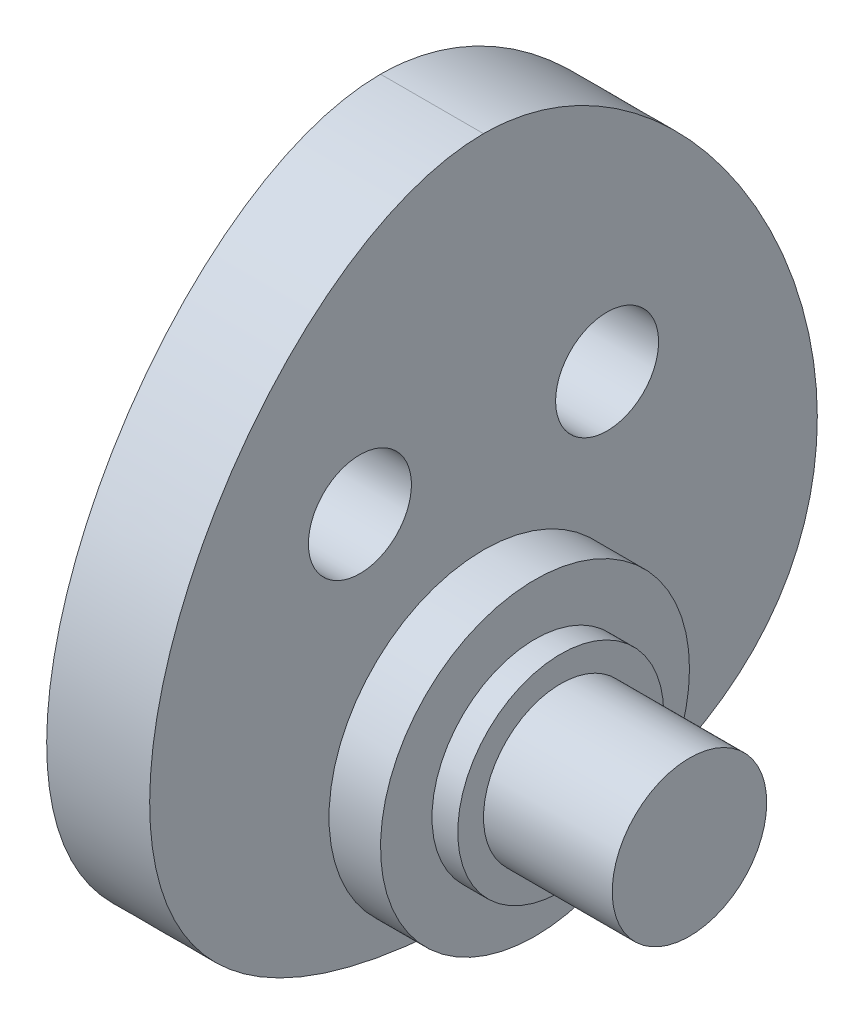
ISO-10303-21;
HEADER;
FILE_DESCRIPTION(('STEP AP214'),'2;1');
FILE_NAME('part.step','',(''),(''),'','','');
FILE_SCHEMA(('AUTOMOTIVE_DESIGN { 1 0 10303 214 1 1 1 1 }'));
ENDSEC;
DATA;
#1=APPLICATION_CONTEXT('core data for automotive mechanical design processes');
#2=APPLICATION_PROTOCOL_DEFINITION('international standard','automotive_design',2000,#1);
#3=PRODUCT_CONTEXT('',#1,'mechanical');
#4=PRODUCT('Part','Part','',(#3));
#5=PRODUCT_RELATED_PRODUCT_CATEGORY('part','',(#4));
#6=PRODUCT_DEFINITION_FORMATION('','',#4);
#7=PRODUCT_DEFINITION_CONTEXT('part definition',#1,'design');
#8=PRODUCT_DEFINITION('design','',#6,#7);
#9=PRODUCT_DEFINITION_SHAPE('','',#8);
#10=(LENGTH_UNIT() NAMED_UNIT(*) SI_UNIT(.MILLI.,.METRE.));
#11=(NAMED_UNIT(*) PLANE_ANGLE_UNIT() SI_UNIT($,.RADIAN.));
#12=(NAMED_UNIT(*) SI_UNIT($,.STERADIAN.) SOLID_ANGLE_UNIT());
#13=UNCERTAINTY_MEASURE_WITH_UNIT(LENGTH_MEASURE(1.E-05),#10,'distance_accuracy_value','');
#14=(GEOMETRIC_REPRESENTATION_CONTEXT(3) GLOBAL_UNCERTAINTY_ASSIGNED_CONTEXT((#13)) GLOBAL_UNIT_ASSIGNED_CONTEXT((#10,
#11,#12)) REPRESENTATION_CONTEXT('',''));
#15=CARTESIAN_POINT('',(0.,0.,0.));
#16=DIRECTION('',(0.,0.,1.));
#17=DIRECTION('',(1.,0.,0.));
#18=AXIS2_PLACEMENT_3D('',#15,#16,#17);
#19=CARTESIAN_POINT('',(6.,0.,0.));
#20=DIRECTION('',(-1.,0.,0.));
#21=DIRECTION('',(0.,0.,1.));
#22=AXIS2_PLACEMENT_3D('',#19,#20,#21);
#23=CYLINDRICAL_SURFACE('',#22,3.);
#24=CARTESIAN_POINT('',(2.,0.,0.));
#25=DIRECTION('',(1.,0.,0.));
#26=DIRECTION('',(0.,0.,-1.));
#27=AXIS2_PLACEMENT_3D('',#24,#25,#26);
#28=CIRCLE('',#27,3.);
#29=CARTESIAN_POINT('',(2.,-3.,1.40842823041895E-13));
#30=VERTEX_POINT('',#29);
#31=EDGE_CURVE('E78',#30,#30,#28,.T.);
#32=ORIENTED_EDGE('',*,*,#31,.T.);
#33=EDGE_LOOP('',(#32));
#34=FACE_BOUND('',#33,.T.);
#35=CARTESIAN_POINT('',(3.,0.,0.));
#36=DIRECTION('',(1.,0.,0.));
#37=DIRECTION('',(0.,0.,-1.));
#38=AXIS2_PLACEMENT_3D('',#35,#36,#37);
#39=CIRCLE('',#38,3.);
#40=CARTESIAN_POINT('',(3.,0.,-3.));
#41=VERTEX_POINT('',#40);
#42=EDGE_CURVE('E39',#41,#41,#39,.T.);
#43=ORIENTED_EDGE('',*,*,#42,.F.);
#44=EDGE_LOOP('',(#43));
#45=FACE_BOUND('',#44,.T.);
#46=ADVANCED_FACE('F35',(#34,#45),#23,.T.);
#47=CARTESIAN_POINT('',(2.,3.49999999999997,-6.31206126052913));
#48=DIRECTION('',(1.,0.,0.));
#49=DIRECTION('',(0.,0.,-1.));
#50=AXIS2_PLACEMENT_3D('',#47,#48,#49);
#51=PLANE('',#50);
#52=CARTESIAN_POINT('',(2.,4.8,2.4));
#53=DIRECTION('',(1.,0.,0.));
#54=DIRECTION('',(0.,0.,-1.));
#55=AXIS2_PLACEMENT_3D('',#52,#53,#54);
#56=CIRCLE('',#55,1.);
#57=CARTESIAN_POINT('',(2.,4.8,3.4));
#58=VERTEX_POINT('',#57);
#59=EDGE_CURVE('E141',#58,#58,#56,.F.);
#60=ORIENTED_EDGE('',*,*,#59,.T.);
#61=EDGE_LOOP('',(#60));
#62=FACE_BOUND('',#61,.T.);
#63=CARTESIAN_POINT('',(2.,4.8,-2.4));
#64=DIRECTION('',(1.,0.,0.));
#65=DIRECTION('',(0.,0.,-1.));
#66=AXIS2_PLACEMENT_3D('',#63,#64,#65);
#67=CIRCLE('',#66,1.);
#68=CARTESIAN_POINT('',(2.,4.8,-1.4));
#69=VERTEX_POINT('',#68);
#70=EDGE_CURVE('E135',#69,#69,#67,.F.);
#71=ORIENTED_EDGE('',*,*,#70,.T.);
#72=EDGE_LOOP('',(#71));
#73=FACE_BOUND('',#72,.T.);
#74=CARTESIAN_POINT('',(2.,10.,0.));
#75=CARTESIAN_POINT('',(2.,10.,5.57539758562265));
#76=CARTESIAN_POINT('',(2.,-3.00000000000011,11.2567657757884));
#77=CARTESIAN_POINT('',(2.,-3.,-1.41577611121383E-13));
#78=B_SPLINE_CURVE_WITH_KNOTS('',3,(#74,#75,#76,#77),.UNSPECIFIED.,.F.,.F.,(4,4),(0.,1.),.UNSPECIFIED.);
#79=CARTESIAN_POINT('',(2.,10.,0.));
#80=VERTEX_POINT('',#79);
#81=EDGE_CURVE('E52',#80,#30,#78,.T.);
#82=ORIENTED_EDGE('',*,*,#81,.T.);
#83=ORIENTED_EDGE('',*,*,#31,.F.);
#84=CARTESIAN_POINT('',(2.,-3.,1.40842823041895E-13));
#85=CARTESIAN_POINT('',(2.,-3.00000000000011,-11.2567657757884));
#86=CARTESIAN_POINT('',(2.,10.,-5.57539758562265));
#87=CARTESIAN_POINT('',(2.,10.,0.));
#88=B_SPLINE_CURVE_WITH_KNOTS('',3,(#84,#85,#86,#87),.UNSPECIFIED.,.F.,.F.,(4,4),(0.,1.),.UNSPECIFIED.);
#89=EDGE_CURVE('E66',#30,#80,#88,.T.);
#90=ORIENTED_EDGE('',*,*,#89,.T.);
#91=EDGE_LOOP('',(#82,#83,#90));
#92=FACE_BOUND('',#91,.T.);
#93=ADVANCED_FACE('F76',(#62,#73,#92),#51,.T.);
#94=CARTESIAN_POINT('',(0.,3.49999999999997,-6.31206126052913));
#95=DIRECTION('',(1.,0.,0.));
#96=DIRECTION('',(0.,0.,-1.));
#97=AXIS2_PLACEMENT_3D('',#94,#95,#96);
#98=PLANE('',#97);
#99=CARTESIAN_POINT('',(0.,4.8,2.4));
#100=DIRECTION('',(-1.,0.,0.));
#101=DIRECTION('',(0.,0.,1.));
#102=AXIS2_PLACEMENT_3D('',#99,#100,#101);
#103=CIRCLE('',#102,1.);
#104=CARTESIAN_POINT('',(0.,4.8,3.4));
#105=VERTEX_POINT('',#104);
#106=EDGE_CURVE('E138',#105,#105,#103,.T.);
#107=ORIENTED_EDGE('',*,*,#106,.F.);
#108=EDGE_LOOP('',(#107));
#109=FACE_BOUND('',#108,.T.);
#110=CARTESIAN_POINT('',(0.,4.8,-2.4));
#111=DIRECTION('',(-1.,0.,0.));
#112=DIRECTION('',(0.,0.,1.));
#113=AXIS2_PLACEMENT_3D('',#110,#111,#112);
#114=CIRCLE('',#113,1.);
#115=CARTESIAN_POINT('',(0.,4.8,-1.4));
#116=VERTEX_POINT('',#115);
#117=EDGE_CURVE('E132',#116,#116,#114,.T.);
#118=ORIENTED_EDGE('',*,*,#117,.F.);
#119=EDGE_LOOP('',(#118));
#120=FACE_BOUND('',#119,.T.);
#121=CARTESIAN_POINT('',(0.,-3.,1.40842823041895E-13));
#122=CARTESIAN_POINT('',(0.,-3.00000000000011,-11.2567657757884));
#123=CARTESIAN_POINT('',(0.,10.,-5.57539758562265));
#124=CARTESIAN_POINT('',(0.,10.,0.));
#125=B_SPLINE_CURVE_WITH_KNOTS('',3,(#121,#122,#123,#124),.UNSPECIFIED.,.F.,.F.,(4,4),(0.,1.),.UNSPECIFIED.);
#126=CARTESIAN_POINT('',(0.,-3.,-1.41577611121383E-13));
#127=VERTEX_POINT('',#126);
#128=CARTESIAN_POINT('',(0.,10.,0.));
#129=VERTEX_POINT('',#128);
#130=EDGE_CURVE('E88',#127,#129,#125,.T.);
#131=ORIENTED_EDGE('',*,*,#130,.F.);
#132=CARTESIAN_POINT('',(0.,10.,0.));
#133=CARTESIAN_POINT('',(0.,10.,5.57539758562265));
#134=CARTESIAN_POINT('',(0.,-3.00000000000011,11.2567657757884));
#135=CARTESIAN_POINT('',(0.,-3.,-1.41577611121383E-13));
#136=B_SPLINE_CURVE_WITH_KNOTS('',3,(#132,#133,#134,#135),.UNSPECIFIED.,.F.,.F.,(4,4),(0.,1.),.UNSPECIFIED.);
#137=EDGE_CURVE('E61',#129,#127,#136,.T.);
#138=ORIENTED_EDGE('',*,*,#137,.F.);
#139=EDGE_LOOP('',(#131,#138));
#140=FACE_BOUND('',#139,.T.);
#141=CARTESIAN_POINT('',(0.,0.,0.));
#142=DIRECTION('',(1.,0.,0.));
#143=DIRECTION('',(0.,0.,-1.));
#144=AXIS2_PLACEMENT_3D('',#141,#142,#143);
#145=CIRCLE('',#144,2.5);
#146=CARTESIAN_POINT('',(0.,0.,-2.5));
#147=VERTEX_POINT('',#146);
#148=EDGE_CURVE('E130',#147,#147,#145,.T.);
#149=ORIENTED_EDGE('',*,*,#148,.T.);
#150=EDGE_LOOP('',(#149));
#151=FACE_BOUND('',#150,.T.);
#152=ADVANCED_FACE('F99',(#109,#120,#140,#151),#98,.F.);
#153=DIRECTION('',(-1.,0.,0.));
#154=VECTOR('',#153,1.);
#155=SURFACE_OF_LINEAR_EXTRUSION('',#88,#154);
#156=ORIENTED_EDGE('',*,*,#130,.T.);
#157=DIRECTION('',(-1.,0.,0.));
#158=VECTOR('',#157,1.);
#159=CARTESIAN_POINT('',(2.,10.,0.));
#160=LINE('',#159,#158);
#161=EDGE_CURVE('E70',#80,#129,#160,.T.);
#162=ORIENTED_EDGE('',*,*,#161,.F.);
#163=ORIENTED_EDGE('',*,*,#89,.F.);
#164=DIRECTION('',(-1.,0.,0.));
#165=VECTOR('',#164,1.);
#166=CARTESIAN_POINT('',(2.,-3.,-1.41577611121383E-13));
#167=LINE('',#166,#165);
#168=EDGE_CURVE('E69',#30,#127,#167,.T.);
#169=ORIENTED_EDGE('',*,*,#168,.T.);
#170=EDGE_LOOP('',(#156,#162,#163,#169));
#171=FACE_BOUND('',#170,.T.);
#172=ADVANCED_FACE('F68',(#171),#155,.F.);
#173=DIRECTION('',(-1.,0.,0.));
#174=VECTOR('',#173,1.);
#175=SURFACE_OF_LINEAR_EXTRUSION('',#78,#174);
#176=ORIENTED_EDGE('',*,*,#137,.T.);
#177=ORIENTED_EDGE('',*,*,#168,.F.);
#178=ORIENTED_EDGE('',*,*,#81,.F.);
#179=ORIENTED_EDGE('',*,*,#161,.T.);
#180=EDGE_LOOP('',(#176,#177,#178,#179));
#181=FACE_BOUND('',#180,.T.);
#182=ADVANCED_FACE('F74',(#181),#175,.F.);
#183=CARTESIAN_POINT('',(2.,0.,0.));
#184=DIRECTION('',(-1.,0.,0.));
#185=DIRECTION('',(0.,0.,1.));
#186=AXIS2_PLACEMENT_3D('',#183,#184,#185);
#187=CYLINDRICAL_SURFACE('',#186,2.5);
#188=CARTESIAN_POINT('',(0.999999999999991,0.,0.));
#189=DIRECTION('',(1.,0.,0.));
#190=DIRECTION('',(0.,0.,-1.));
#191=AXIS2_PLACEMENT_3D('',#188,#189,#190);
#192=CIRCLE('',#191,2.5);
#193=CARTESIAN_POINT('',(0.999999999999991,0.,-2.5));
#194=VERTEX_POINT('',#193);
#195=EDGE_CURVE('E45',#194,#194,#192,.T.);
#196=ORIENTED_EDGE('',*,*,#195,.T.);
#197=EDGE_LOOP('',(#196));
#198=FACE_BOUND('',#197,.T.);
#199=ORIENTED_EDGE('',*,*,#148,.F.);
#200=EDGE_LOOP('',(#199));
#201=FACE_BOUND('',#200,.T.);
#202=ADVANCED_FACE('F98',(#198,#201),#187,.F.);
#203=CARTESIAN_POINT('',(2.,0.,0.));
#204=DIRECTION('',(1.,0.,0.));
#205=DIRECTION('',(0.,0.,-1.));
#206=AXIS2_PLACEMENT_3D('',#203,#204,#205);
#207=PLANE('',#206);
#208=CARTESIAN_POINT('',(2.,0.,0.));
#209=DIRECTION('',(1.,0.,0.));
#210=DIRECTION('',(0.,0.,-1.));
#211=AXIS2_PLACEMENT_3D('',#208,#209,#210);
#212=CIRCLE('',#211,1.5);
#213=CARTESIAN_POINT('',(2.,0.,-1.5));
#214=VERTEX_POINT('',#213);
#215=EDGE_CURVE('E12',#214,#214,#212,.F.);
#216=ORIENTED_EDGE('',*,*,#215,.T.);
#217=EDGE_LOOP('',(#216));
#218=FACE_BOUND('',#217,.T.);
#219=ADVANCED_FACE('F116',(#218),#207,.F.);
#220=CARTESIAN_POINT('',(6.001,4.8,-2.4));
#221=DIRECTION('',(-1.,0.,0.));
#222=DIRECTION('',(0.,0.,1.));
#223=AXIS2_PLACEMENT_3D('',#220,#221,#222);
#224=CYLINDRICAL_SURFACE('',#223,1.);
#225=CARTESIAN_POINT('',(2.,4.8,-1.4));
#226=CARTESIAN_POINT('',(1.97916666666667,4.8,-1.4));
#227=CARTESIAN_POINT('',(1.95833333333333,4.8,-1.4));
#228=CARTESIAN_POINT('',(1.91666666666667,4.8,-1.4));
#229=CARTESIAN_POINT('',(1.89583333333333,4.8,-1.4));
#230=CARTESIAN_POINT('',(1.85416666666667,4.8,-1.4));
#231=CARTESIAN_POINT('',(1.83333333333333,4.8,-1.4));
#232=CARTESIAN_POINT('',(1.79166666666667,4.8,-1.4));
#233=CARTESIAN_POINT('',(1.77083333333333,4.8,-1.4));
#234=CARTESIAN_POINT('',(1.72916666666667,4.8,-1.4));
#235=CARTESIAN_POINT('',(1.70833333333333,4.8,-1.4));
#236=CARTESIAN_POINT('',(1.66666666666667,4.8,-1.4));
#237=CARTESIAN_POINT('',(1.64583333333333,4.8,-1.4));
#238=CARTESIAN_POINT('',(1.60416666666667,4.8,-1.4));
#239=CARTESIAN_POINT('',(1.58333333333333,4.8,-1.4));
#240=CARTESIAN_POINT('',(1.54166666666667,4.8,-1.4));
#241=CARTESIAN_POINT('',(1.52083333333333,4.8,-1.4));
#242=CARTESIAN_POINT('',(1.47916666666667,4.8,-1.4));
#243=CARTESIAN_POINT('',(1.45833333333333,4.8,-1.4));
#244=CARTESIAN_POINT('',(1.41666666666667,4.8,-1.4));
#245=CARTESIAN_POINT('',(1.39583333333333,4.8,-1.4));
#246=CARTESIAN_POINT('',(1.35416666666667,4.8,-1.4));
#247=CARTESIAN_POINT('',(1.33333333333333,4.8,-1.4));
#248=CARTESIAN_POINT('',(1.29166666666667,4.8,-1.4));
#249=CARTESIAN_POINT('',(1.27083333333333,4.8,-1.4));
#250=CARTESIAN_POINT('',(1.22916666666667,4.8,-1.4));
#251=CARTESIAN_POINT('',(1.20833333333333,4.8,-1.4));
#252=CARTESIAN_POINT('',(1.16666666666667,4.8,-1.4));
#253=CARTESIAN_POINT('',(1.14583333333333,4.8,-1.4));
#254=CARTESIAN_POINT('',(1.10416666666667,4.8,-1.4));
#255=CARTESIAN_POINT('',(1.08333333333333,4.8,-1.4));
#256=CARTESIAN_POINT('',(1.04166666666667,4.8,-1.4));
#257=CARTESIAN_POINT('',(1.02083333333333,4.8,-1.4));
#258=CARTESIAN_POINT('',(0.979166666666667,4.8,-1.4));
#259=CARTESIAN_POINT('',(0.958333333333333,4.8,-1.4));
#260=CARTESIAN_POINT('',(0.916666666666667,4.8,-1.4));
#261=CARTESIAN_POINT('',(0.895833333333333,4.8,-1.4));
#262=CARTESIAN_POINT('',(0.854166666666667,4.8,-1.4));
#263=CARTESIAN_POINT('',(0.833333333333333,4.8,-1.4));
#264=CARTESIAN_POINT('',(0.791666666666667,4.8,-1.4));
#265=CARTESIAN_POINT('',(0.770833333333333,4.8,-1.4));
#266=CARTESIAN_POINT('',(0.729166666666667,4.8,-1.4));
#267=CARTESIAN_POINT('',(0.708333333333333,4.8,-1.4));
#268=CARTESIAN_POINT('',(0.666666666666667,4.8,-1.4));
#269=CARTESIAN_POINT('',(0.645833333333334,4.8,-1.4));
#270=CARTESIAN_POINT('',(0.604166666666667,4.8,-1.4));
#271=CARTESIAN_POINT('',(0.583333333333334,4.8,-1.4));
#272=CARTESIAN_POINT('',(0.541666666666667,4.8,-1.4));
#273=CARTESIAN_POINT('',(0.520833333333334,4.8,-1.4));
#274=CARTESIAN_POINT('',(0.479166666666667,4.8,-1.4));
#275=CARTESIAN_POINT('',(0.458333333333334,4.8,-1.4));
#276=CARTESIAN_POINT('',(0.416666666666667,4.8,-1.4));
#277=CARTESIAN_POINT('',(0.395833333333334,4.8,-1.4));
#278=CARTESIAN_POINT('',(0.354166666666667,4.8,-1.4));
#279=CARTESIAN_POINT('',(0.333333333333334,4.8,-1.4));
#280=CARTESIAN_POINT('',(0.291666666666667,4.8,-1.4));
#281=CARTESIAN_POINT('',(0.270833333333334,4.8,-1.4));
#282=CARTESIAN_POINT('',(0.229166666666667,4.8,-1.4));
#283=CARTESIAN_POINT('',(0.208333333333334,4.8,-1.4));
#284=CARTESIAN_POINT('',(0.166666666666667,4.8,-1.4));
#285=CARTESIAN_POINT('',(0.145833333333333,4.8,-1.4));
#286=CARTESIAN_POINT('',(0.104166666666667,4.8,-1.4));
#287=CARTESIAN_POINT('',(0.0833333333333334,4.8,-1.4));
#288=CARTESIAN_POINT('',(0.0416666666666667,4.8,-1.4));
#289=CARTESIAN_POINT('',(0.0208333333333333,4.8,-1.4));
#290=CARTESIAN_POINT('',(0.,4.8,-1.4));
#291=B_SPLINE_CURVE_WITH_KNOTS('',3,(#225,#226,#227,#228,#229,#230,#231,#232,#233,#234,#235,
#236,#237,#238,#239,#240,#241,#242,#243,#244,#245,#246,#247,#248,#249,#250,#251,#252,#253,#254,
#255,#256,#257,#258,#259,#260,#261,#262,#263,#264,#265,#266,#267,#268,#269,#270,#271,#272,#273,
#274,#275,#276,#277,#278,#279,#280,#281,#282,#283,#284,#285,#286,#287,#288,#289,#290),
.UNSPECIFIED.,.F.,.F.,(4,2,2,2,2,2,2,2,2,2,2,2,2,2,2,2,2,2,2,2,2,2,2,2,2,2,2,2,2,2,2,2,4),(0.,
0.0625000000000001,0.125,0.1875,0.25,0.3125,0.375,0.4375,0.5,0.5625,0.625,0.6875,0.75,0.8125,
0.875,0.9375,1.,1.0625,1.125,1.1875,1.25,1.3125,1.375,1.4375,1.5,1.5625,1.625,1.6875,1.75,
1.8125,1.875,1.9375,2.),.UNSPECIFIED.);
#292=EDGE_CURVE('BSEAM123',#69,#116,#291,.T.);
#293=ORIENTED_EDGE('',*,*,#70,.F.);
#294=ORIENTED_EDGE('',*,*,#117,.T.);
#295=ORIENTED_EDGE('',*,*,#292,.T.);
#296=ORIENTED_EDGE('',*,*,#292,.F.);
#297=EDGE_LOOP('',(#293,#295,#294,#296));
#298=FACE_BOUND('',#297,.T.);
#299=ADVANCED_FACE('F123',(#298),#224,.F.);
#300=CARTESIAN_POINT('',(6.001,4.8,2.4));
#301=DIRECTION('',(-1.,0.,0.));
#302=DIRECTION('',(0.,0.,1.));
#303=AXIS2_PLACEMENT_3D('',#300,#301,#302);
#304=CYLINDRICAL_SURFACE('',#303,1.);
#305=CARTESIAN_POINT('',(2.,4.8,3.4));
#306=CARTESIAN_POINT('',(1.97916666666667,4.8,3.4));
#307=CARTESIAN_POINT('',(1.95833333333333,4.8,3.4));
#308=CARTESIAN_POINT('',(1.91666666666667,4.8,3.4));
#309=CARTESIAN_POINT('',(1.89583333333333,4.8,3.4));
#310=CARTESIAN_POINT('',(1.85416666666667,4.8,3.4));
#311=CARTESIAN_POINT('',(1.83333333333333,4.8,3.4));
#312=CARTESIAN_POINT('',(1.79166666666667,4.8,3.4));
#313=CARTESIAN_POINT('',(1.77083333333333,4.8,3.4));
#314=CARTESIAN_POINT('',(1.72916666666667,4.8,3.4));
#315=CARTESIAN_POINT('',(1.70833333333333,4.8,3.4));
#316=CARTESIAN_POINT('',(1.66666666666667,4.8,3.4));
#317=CARTESIAN_POINT('',(1.64583333333333,4.8,3.4));
#318=CARTESIAN_POINT('',(1.60416666666667,4.8,3.4));
#319=CARTESIAN_POINT('',(1.58333333333333,4.8,3.4));
#320=CARTESIAN_POINT('',(1.54166666666667,4.8,3.4));
#321=CARTESIAN_POINT('',(1.52083333333333,4.8,3.4));
#322=CARTESIAN_POINT('',(1.47916666666667,4.8,3.4));
#323=CARTESIAN_POINT('',(1.45833333333333,4.8,3.4));
#324=CARTESIAN_POINT('',(1.41666666666667,4.8,3.4));
#325=CARTESIAN_POINT('',(1.39583333333333,4.8,3.4));
#326=CARTESIAN_POINT('',(1.35416666666667,4.8,3.4));
#327=CARTESIAN_POINT('',(1.33333333333333,4.8,3.4));
#328=CARTESIAN_POINT('',(1.29166666666667,4.8,3.4));
#329=CARTESIAN_POINT('',(1.27083333333333,4.8,3.4));
#330=CARTESIAN_POINT('',(1.22916666666667,4.8,3.4));
#331=CARTESIAN_POINT('',(1.20833333333333,4.8,3.4));
#332=CARTESIAN_POINT('',(1.16666666666667,4.8,3.4));
#333=CARTESIAN_POINT('',(1.14583333333333,4.8,3.4));
#334=CARTESIAN_POINT('',(1.10416666666667,4.8,3.4));
#335=CARTESIAN_POINT('',(1.08333333333333,4.8,3.4));
#336=CARTESIAN_POINT('',(1.04166666666667,4.8,3.4));
#337=CARTESIAN_POINT('',(1.02083333333333,4.8,3.4));
#338=CARTESIAN_POINT('',(0.979166666666667,4.8,3.4));
#339=CARTESIAN_POINT('',(0.958333333333333,4.8,3.4));
#340=CARTESIAN_POINT('',(0.916666666666667,4.8,3.4));
#341=CARTESIAN_POINT('',(0.895833333333333,4.8,3.4));
#342=CARTESIAN_POINT('',(0.854166666666667,4.8,3.4));
#343=CARTESIAN_POINT('',(0.833333333333333,4.8,3.4));
#344=CARTESIAN_POINT('',(0.791666666666667,4.8,3.4));
#345=CARTESIAN_POINT('',(0.770833333333333,4.8,3.4));
#346=CARTESIAN_POINT('',(0.729166666666667,4.8,3.4));
#347=CARTESIAN_POINT('',(0.708333333333333,4.8,3.4));
#348=CARTESIAN_POINT('',(0.666666666666667,4.8,3.4));
#349=CARTESIAN_POINT('',(0.645833333333334,4.8,3.4));
#350=CARTESIAN_POINT('',(0.604166666666667,4.8,3.4));
#351=CARTESIAN_POINT('',(0.583333333333334,4.8,3.4));
#352=CARTESIAN_POINT('',(0.541666666666667,4.8,3.4));
#353=CARTESIAN_POINT('',(0.520833333333334,4.8,3.4));
#354=CARTESIAN_POINT('',(0.479166666666667,4.8,3.4));
#355=CARTESIAN_POINT('',(0.458333333333334,4.8,3.4));
#356=CARTESIAN_POINT('',(0.416666666666667,4.8,3.4));
#357=CARTESIAN_POINT('',(0.395833333333334,4.8,3.4));
#358=CARTESIAN_POINT('',(0.354166666666667,4.8,3.4));
#359=CARTESIAN_POINT('',(0.333333333333334,4.8,3.4));
#360=CARTESIAN_POINT('',(0.291666666666667,4.8,3.4));
#361=CARTESIAN_POINT('',(0.270833333333334,4.8,3.4));
#362=CARTESIAN_POINT('',(0.229166666666667,4.8,3.4));
#363=CARTESIAN_POINT('',(0.208333333333334,4.8,3.4));
#364=CARTESIAN_POINT('',(0.166666666666667,4.8,3.4));
#365=CARTESIAN_POINT('',(0.145833333333333,4.8,3.4));
#366=CARTESIAN_POINT('',(0.104166666666667,4.8,3.4));
#367=CARTESIAN_POINT('',(0.0833333333333334,4.8,3.4));
#368=CARTESIAN_POINT('',(0.0416666666666667,4.8,3.4));
#369=CARTESIAN_POINT('',(0.0208333333333333,4.8,3.4));
#370=CARTESIAN_POINT('',(0.,4.8,3.4));
#371=B_SPLINE_CURVE_WITH_KNOTS('',3,(#305,#306,#307,#308,#309,#310,#311,#312,#313,#314,#315,
#316,#317,#318,#319,#320,#321,#322,#323,#324,#325,#326,#327,#328,#329,#330,#331,#332,#333,#334,
#335,#336,#337,#338,#339,#340,#341,#342,#343,#344,#345,#346,#347,#348,#349,#350,#351,#352,#353,
#354,#355,#356,#357,#358,#359,#360,#361,#362,#363,#364,#365,#366,#367,#368,#369,#370),
.UNSPECIFIED.,.F.,.F.,(4,2,2,2,2,2,2,2,2,2,2,2,2,2,2,2,2,2,2,2,2,2,2,2,2,2,2,2,2,2,2,2,4),(0.,
0.0625000000000001,0.125,0.1875,0.25,0.3125,0.375,0.4375,0.5,0.5625,0.625,0.6875,0.75,0.8125,
0.875,0.9375,1.,1.0625,1.125,1.1875,1.25,1.3125,1.375,1.4375,1.5,1.5625,1.625,1.6875,1.75,
1.8125,1.875,1.9375,2.),.UNSPECIFIED.);
#372=EDGE_CURVE('BSEAM173',#58,#105,#371,.T.);
#373=ORIENTED_EDGE('',*,*,#59,.F.);
#374=ORIENTED_EDGE('',*,*,#106,.T.);
#375=ORIENTED_EDGE('',*,*,#372,.T.);
#376=ORIENTED_EDGE('',*,*,#372,.F.);
#377=EDGE_LOOP('',(#373,#375,#374,#376));
#378=FACE_BOUND('',#377,.T.);
#379=ADVANCED_FACE('F173',(#378),#304,.F.);
#380=CARTESIAN_POINT('',(0.999999999999991,0.,0.));
#381=DIRECTION('',(-1.,0.,0.));
#382=DIRECTION('',(0.,0.,1.));
#383=AXIS2_PLACEMENT_3D('',#380,#381,#382);
#384=CONICAL_SURFACE('',#383,2.5,0.785398163397442);
#385=ORIENTED_EDGE('',*,*,#215,.F.);
#386=EDGE_LOOP('',(#385));
#387=FACE_BOUND('',#386,.T.);
#388=ORIENTED_EDGE('',*,*,#195,.F.);
#389=EDGE_LOOP('',(#388));
#390=FACE_BOUND('',#389,.T.);
#391=ADVANCED_FACE('F37',(#387,#390),#384,.F.);
#392=CARTESIAN_POINT('',(3.,3.49999999999998,0.));
#393=DIRECTION('',(1.,0.,0.));
#394=DIRECTION('',(0.,0.,-1.));
#395=AXIS2_PLACEMENT_3D('',#392,#393,#394);
#396=PLANE('',#395);
#397=CARTESIAN_POINT('',(3.,0.,0.));
#398=DIRECTION('',(1.,0.,0.));
#399=DIRECTION('',(0.,0.,-1.));
#400=AXIS2_PLACEMENT_3D('',#397,#398,#399);
#401=CIRCLE('',#400,2.);
#402=CARTESIAN_POINT('',(3.,0.,-2.));
#403=VERTEX_POINT('',#402);
#404=EDGE_CURVE('E155',#403,#403,#401,.T.);
#405=ORIENTED_EDGE('',*,*,#404,.F.);
#406=EDGE_LOOP('',(#405));
#407=FACE_BOUND('',#406,.T.);
#408=ORIENTED_EDGE('',*,*,#42,.T.);
#409=EDGE_LOOP('',(#408));
#410=FACE_BOUND('',#409,.T.);
#411=ADVANCED_FACE('F162',(#407,#410),#396,.T.);
#412=CARTESIAN_POINT('',(3.,0.,0.));
#413=DIRECTION('',(1.,0.,0.));
#414=DIRECTION('',(0.,0.,-1.));
#415=AXIS2_PLACEMENT_3D('',#412,#413,#414);
#416=CYLINDRICAL_SURFACE('',#415,2.);
#417=ORIENTED_EDGE('',*,*,#404,.T.);
#418=EDGE_LOOP('',(#417));
#419=FACE_BOUND('',#418,.T.);
#420=CARTESIAN_POINT('',(3.5,0.,0.));
#421=DIRECTION('',(1.,0.,0.));
#422=DIRECTION('',(0.,0.,-1.));
#423=AXIS2_PLACEMENT_3D('',#420,#421,#422);
#424=CIRCLE('',#423,2.);
#425=CARTESIAN_POINT('',(3.5,0.,-2.));
#426=VERTEX_POINT('',#425);
#427=EDGE_CURVE('E152',#426,#426,#424,.T.);
#428=ORIENTED_EDGE('',*,*,#427,.F.);
#429=EDGE_LOOP('',(#428));
#430=FACE_BOUND('',#429,.T.);
#431=ADVANCED_FACE('F164',(#419,#430),#416,.T.);
#432=CARTESIAN_POINT('',(6.,0.,0.));
#433=DIRECTION('',(1.,0.,0.));
#434=DIRECTION('',(0.,0.,-1.));
#435=AXIS2_PLACEMENT_3D('',#432,#433,#434);
#436=PLANE('',#435);
#437=CARTESIAN_POINT('',(6.,0.,0.));
#438=DIRECTION('',(1.,0.,0.));
#439=DIRECTION('',(0.,0.,-1.));
#440=AXIS2_PLACEMENT_3D('',#437,#438,#439);
#441=CIRCLE('',#440,1.5);
#442=CARTESIAN_POINT('',(6.,0.,-1.5));
#443=VERTEX_POINT('',#442);
#444=EDGE_CURVE('E147',#443,#443,#441,.T.);
#445=ORIENTED_EDGE('',*,*,#444,.T.);
#446=EDGE_LOOP('',(#445));
#447=FACE_BOUND('',#446,.T.);
#448=ADVANCED_FACE('F171',(#447),#436,.T.);
#449=CARTESIAN_POINT('',(3.5,0.,0.));
#450=DIRECTION('',(1.,0.,0.));
#451=DIRECTION('',(0.,0.,-1.));
#452=AXIS2_PLACEMENT_3D('',#449,#450,#451);
#453=CYLINDRICAL_SURFACE('',#452,1.5);
#454=CARTESIAN_POINT('',(3.5,0.,0.));
#455=DIRECTION('',(1.,0.,0.));
#456=DIRECTION('',(0.,0.,-1.));
#457=AXIS2_PLACEMENT_3D('',#454,#455,#456);
#458=CIRCLE('',#457,1.5);
#459=CARTESIAN_POINT('',(3.5,0.,-1.5));
#460=VERTEX_POINT('',#459);
#461=EDGE_CURVE('E144',#460,#460,#458,.T.);
#462=ORIENTED_EDGE('',*,*,#461,.T.);
#463=EDGE_LOOP('',(#462));
#464=FACE_BOUND('',#463,.T.);
#465=ORIENTED_EDGE('',*,*,#444,.F.);
#466=EDGE_LOOP('',(#465));
#467=FACE_BOUND('',#466,.T.);
#468=ADVANCED_FACE('F176',(#464,#467),#453,.T.);
#469=CARTESIAN_POINT('',(3.5,3.49999999999998,0.));
#470=DIRECTION('',(1.,0.,0.));
#471=DIRECTION('',(0.,0.,-1.));
#472=AXIS2_PLACEMENT_3D('',#469,#470,#471);
#473=PLANE('',#472);
#474=ORIENTED_EDGE('',*,*,#461,.F.);
#475=EDGE_LOOP('',(#474));
#476=FACE_BOUND('',#475,.T.);
#477=ORIENTED_EDGE('',*,*,#427,.T.);
#478=EDGE_LOOP('',(#477));
#479=FACE_BOUND('',#478,.T.);
#480=ADVANCED_FACE('F179',(#476,#479),#473,.T.);
#481=CLOSED_SHELL('',(#46,#93,#152,#172,#182,#202,#219,#299,#379,#391,#411,#431,#448,#468,#480));
#482=MANIFOLD_SOLID_BREP('B2',#481);
#483=ADVANCED_BREP_SHAPE_REPRESENTATION('',(#18,#482),#14);
#484=SHAPE_DEFINITION_REPRESENTATION(#9,#483);
ENDSEC;
END-ISO-10303-21;
